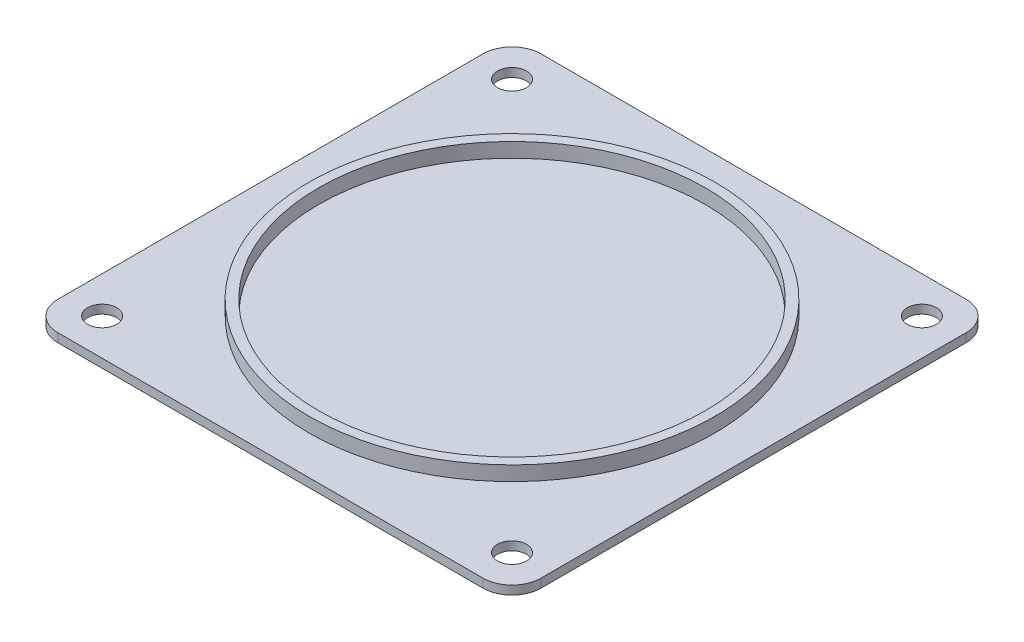
ISO-10303-21;
HEADER;
FILE_DESCRIPTION(('STEP AP214'),'2;1');
FILE_NAME('part.step','',(''),(''),'','','');
FILE_SCHEMA(('AUTOMOTIVE_DESIGN { 1 0 10303 214 1 1 1 1 }'));
ENDSEC;
DATA;
#1=APPLICATION_CONTEXT('core data for automotive mechanical design processes');
#2=APPLICATION_PROTOCOL_DEFINITION('international standard','automotive_design',2000,#1);
#3=PRODUCT_CONTEXT('',#1,'mechanical');
#4=PRODUCT('Part','Part','',(#3));
#5=PRODUCT_RELATED_PRODUCT_CATEGORY('part','',(#4));
#6=PRODUCT_DEFINITION_FORMATION('','',#4);
#7=PRODUCT_DEFINITION_CONTEXT('part definition',#1,'design');
#8=PRODUCT_DEFINITION('design','',#6,#7);
#9=PRODUCT_DEFINITION_SHAPE('','',#8);
#10=(LENGTH_UNIT() NAMED_UNIT(*) SI_UNIT(.MILLI.,.METRE.));
#11=(NAMED_UNIT(*) PLANE_ANGLE_UNIT() SI_UNIT($,.RADIAN.));
#12=(NAMED_UNIT(*) SI_UNIT($,.STERADIAN.) SOLID_ANGLE_UNIT());
#13=UNCERTAINTY_MEASURE_WITH_UNIT(LENGTH_MEASURE(1.E-05),#10,'distance_accuracy_value','');
#14=(GEOMETRIC_REPRESENTATION_CONTEXT(3) GLOBAL_UNCERTAINTY_ASSIGNED_CONTEXT((#13)) GLOBAL_UNIT_ASSIGNED_CONTEXT((#10,
#11,#12)) REPRESENTATION_CONTEXT('',''));
#15=CARTESIAN_POINT('',(0.,0.,0.));
#16=DIRECTION('',(0.,0.,1.));
#17=DIRECTION('',(1.,0.,0.));
#18=AXIS2_PLACEMENT_3D('',#15,#16,#17);
#19=CARTESIAN_POINT('',(0.,1.8,0.));
#20=DIRECTION('',(0.,1.,0.));
#21=DIRECTION('',(0.,0.,1.));
#22=AXIS2_PLACEMENT_3D('',#19,#20,#21);
#23=PLANE('',#22);
#24=CARTESIAN_POINT('',(0.,1.8,0.));
#25=DIRECTION('',(0.,1.,0.));
#26=DIRECTION('',(0.,0.,1.));
#27=AXIS2_PLACEMENT_3D('',#24,#25,#26);
#28=CIRCLE('',#27,42.);
#29=CARTESIAN_POINT('',(0.,1.8,42.));
#30=VERTEX_POINT('',#29);
#31=EDGE_CURVE('E202',#30,#30,#28,.T.);
#32=ORIENTED_EDGE('',*,*,#31,.F.);
#33=EDGE_LOOP('',(#32));
#34=FACE_BOUND('',#33,.T.);
#35=CARTESIAN_POINT('',(42.425,1.8,42.425));
#36=DIRECTION('',(0.,1.,0.));
#37=DIRECTION('',(0.,0.,1.));
#38=AXIS2_PLACEMENT_3D('',#35,#36,#37);
#39=CIRCLE('',#38,3.);
#40=CARTESIAN_POINT('',(42.425,1.8,45.425));
#41=VERTEX_POINT('',#40);
#42=EDGE_CURVE('E187',#41,#41,#39,.T.);
#43=ORIENTED_EDGE('',*,*,#42,.F.);
#44=EDGE_LOOP('',(#43));
#45=FACE_BOUND('',#44,.T.);
#46=CARTESIAN_POINT('',(-42.425,1.8,-42.425));
#47=DIRECTION('',(0.,1.,0.));
#48=DIRECTION('',(0.,0.,1.));
#49=AXIS2_PLACEMENT_3D('',#46,#47,#48);
#50=CIRCLE('',#49,3.);
#51=CARTESIAN_POINT('',(-42.425,1.8,-39.425));
#52=VERTEX_POINT('',#51);
#53=EDGE_CURVE('E171',#52,#52,#50,.T.);
#54=ORIENTED_EDGE('',*,*,#53,.F.);
#55=EDGE_LOOP('',(#54));
#56=FACE_BOUND('',#55,.T.);
#57=DIRECTION('',(0.,0.,1.));
#58=VECTOR('',#57,1.);
#59=CARTESIAN_POINT('',(-50.,1.8,-50.));
#60=LINE('',#59,#58);
#61=CARTESIAN_POINT('',(-50.,1.8,-44.));
#62=VERTEX_POINT('',#61);
#63=CARTESIAN_POINT('',(-50.,1.8,44.));
#64=VERTEX_POINT('',#63);
#65=EDGE_CURVE('E175',#62,#64,#60,.T.);
#66=ORIENTED_EDGE('',*,*,#65,.T.);
#67=CARTESIAN_POINT('',(-44.,1.8,44.));
#68=DIRECTION('',(0.,1.,0.));
#69=DIRECTION('',(0.,0.,1.));
#70=AXIS2_PLACEMENT_3D('',#67,#68,#69);
#71=CIRCLE('',#70,6.);
#72=CARTESIAN_POINT('',(-44.,1.8,50.));
#73=VERTEX_POINT('',#72);
#74=EDGE_CURVE('E148',#64,#73,#71,.T.);
#75=ORIENTED_EDGE('',*,*,#74,.T.);
#76=DIRECTION('',(1.,0.,0.));
#77=VECTOR('',#76,1.);
#78=CARTESIAN_POINT('',(-50.,1.8,50.));
#79=LINE('',#78,#77);
#80=CARTESIAN_POINT('',(44.,1.8,50.));
#81=VERTEX_POINT('',#80);
#82=EDGE_CURVE('E119',#73,#81,#79,.T.);
#83=ORIENTED_EDGE('',*,*,#82,.T.);
#84=CARTESIAN_POINT('',(44.,1.8,44.));
#85=DIRECTION('',(0.,1.,0.));
#86=DIRECTION('',(0.,0.,1.));
#87=AXIS2_PLACEMENT_3D('',#84,#85,#86);
#88=CIRCLE('',#87,6.);
#89=CARTESIAN_POINT('',(50.,1.8,44.));
#90=VERTEX_POINT('',#89);
#91=EDGE_CURVE('E143',#81,#90,#88,.T.);
#92=ORIENTED_EDGE('',*,*,#91,.T.);
#93=DIRECTION('',(0.,0.,-1.));
#94=VECTOR('',#93,1.);
#95=CARTESIAN_POINT('',(50.,1.8,-50.));
#96=LINE('',#95,#94);
#97=CARTESIAN_POINT('',(50.,1.8,-44.));
#98=VERTEX_POINT('',#97);
#99=EDGE_CURVE('E126',#90,#98,#96,.T.);
#100=ORIENTED_EDGE('',*,*,#99,.T.);
#101=CARTESIAN_POINT('',(44.,1.8,-44.));
#102=DIRECTION('',(0.,1.,0.));
#103=DIRECTION('',(0.,0.,1.));
#104=AXIS2_PLACEMENT_3D('',#101,#102,#103);
#105=CIRCLE('',#104,6.);
#106=CARTESIAN_POINT('',(44.,1.8,-50.));
#107=VERTEX_POINT('',#106);
#108=EDGE_CURVE('E54',#98,#107,#105,.T.);
#109=ORIENTED_EDGE('',*,*,#108,.T.);
#110=DIRECTION('',(-1.,0.,0.));
#111=VECTOR('',#110,1.);
#112=CARTESIAN_POINT('',(-50.,1.8,-50.));
#113=LINE('',#112,#111);
#114=CARTESIAN_POINT('',(-44.,1.8,-50.));
#115=VERTEX_POINT('',#114);
#116=EDGE_CURVE('E129',#107,#115,#113,.T.);
#117=ORIENTED_EDGE('',*,*,#116,.T.);
#118=CARTESIAN_POINT('',(-44.,1.8,-44.));
#119=DIRECTION('',(0.,1.,0.));
#120=DIRECTION('',(0.,0.,1.));
#121=AXIS2_PLACEMENT_3D('',#118,#119,#120);
#122=CIRCLE('',#121,6.);
#123=EDGE_CURVE('E146',#115,#62,#122,.T.);
#124=ORIENTED_EDGE('',*,*,#123,.T.);
#125=EDGE_LOOP('',(#66,#75,#83,#92,#100,#109,#117,#124));
#126=FACE_BOUND('',#125,.T.);
#127=CARTESIAN_POINT('',(42.425,1.8,-42.425));
#128=DIRECTION('',(0.,1.,0.));
#129=DIRECTION('',(0.,0.,1.));
#130=AXIS2_PLACEMENT_3D('',#127,#128,#129);
#131=CIRCLE('',#130,3.);
#132=CARTESIAN_POINT('',(42.425,1.8,-39.425));
#133=VERTEX_POINT('',#132);
#134=EDGE_CURVE('E181',#133,#133,#131,.T.);
#135=ORIENTED_EDGE('',*,*,#134,.F.);
#136=EDGE_LOOP('',(#135));
#137=FACE_BOUND('',#136,.T.);
#138=CARTESIAN_POINT('',(-42.425,1.8,42.425));
#139=DIRECTION('',(0.,1.,0.));
#140=DIRECTION('',(0.,0.,1.));
#141=AXIS2_PLACEMENT_3D('',#138,#139,#140);
#142=CIRCLE('',#141,3.);
#143=CARTESIAN_POINT('',(-42.425,1.8,45.425));
#144=VERTEX_POINT('',#143);
#145=EDGE_CURVE('E193',#144,#144,#142,.T.);
#146=ORIENTED_EDGE('',*,*,#145,.F.);
#147=EDGE_LOOP('',(#146));
#148=FACE_BOUND('',#147,.T.);
#149=ADVANCED_FACE('F32',(#34,#45,#56,#126,#137,#148),#23,.T.);
#150=CARTESIAN_POINT('',(0.,0.,0.));
#151=DIRECTION('',(0.,1.,0.));
#152=DIRECTION('',(0.,0.,1.));
#153=AXIS2_PLACEMENT_3D('',#150,#151,#152);
#154=PLANE('',#153);
#155=DIRECTION('',(1.,0.,0.));
#156=VECTOR('',#155,1.);
#157=CARTESIAN_POINT('',(-50.,0.,50.));
#158=LINE('',#157,#156);
#159=CARTESIAN_POINT('',(-44.,0.,50.));
#160=VERTEX_POINT('',#159);
#161=CARTESIAN_POINT('',(44.,0.,50.));
#162=VERTEX_POINT('',#161);
#163=EDGE_CURVE('E116',#160,#162,#158,.T.);
#164=ORIENTED_EDGE('',*,*,#163,.F.);
#165=CARTESIAN_POINT('',(-44.,0.,44.));
#166=DIRECTION('',(0.,1.,0.));
#167=DIRECTION('',(0.,0.,1.));
#168=AXIS2_PLACEMENT_3D('',#165,#166,#167);
#169=CIRCLE('',#168,6.);
#170=CARTESIAN_POINT('',(-50.,0.,44.));
#171=VERTEX_POINT('',#170);
#172=EDGE_CURVE('E99',#160,#171,#169,.F.);
#173=ORIENTED_EDGE('',*,*,#172,.T.);
#174=DIRECTION('',(0.,0.,1.));
#175=VECTOR('',#174,1.);
#176=CARTESIAN_POINT('',(-50.,0.,-50.));
#177=LINE('',#176,#175);
#178=CARTESIAN_POINT('',(-50.,0.,-44.));
#179=VERTEX_POINT('',#178);
#180=EDGE_CURVE('E127',#179,#171,#177,.T.);
#181=ORIENTED_EDGE('',*,*,#180,.F.);
#182=CARTESIAN_POINT('',(-44.,0.,-44.));
#183=DIRECTION('',(0.,1.,0.));
#184=DIRECTION('',(0.,0.,1.));
#185=AXIS2_PLACEMENT_3D('',#182,#183,#184);
#186=CIRCLE('',#185,6.);
#187=CARTESIAN_POINT('',(-44.,0.,-50.));
#188=VERTEX_POINT('',#187);
#189=EDGE_CURVE('E110',#179,#188,#186,.F.);
#190=ORIENTED_EDGE('',*,*,#189,.T.);
#191=DIRECTION('',(-1.,0.,0.));
#192=VECTOR('',#191,1.);
#193=CARTESIAN_POINT('',(-50.,0.,-50.));
#194=LINE('',#193,#192);
#195=CARTESIAN_POINT('',(44.,0.,-50.));
#196=VERTEX_POINT('',#195);
#197=EDGE_CURVE('E131',#196,#188,#194,.T.);
#198=ORIENTED_EDGE('',*,*,#197,.F.);
#199=CARTESIAN_POINT('',(44.,0.,-44.));
#200=DIRECTION('',(0.,1.,0.));
#201=DIRECTION('',(0.,0.,1.));
#202=AXIS2_PLACEMENT_3D('',#199,#200,#201);
#203=CIRCLE('',#202,6.);
#204=CARTESIAN_POINT('',(50.,0.,-44.));
#205=VERTEX_POINT('',#204);
#206=EDGE_CURVE('E137',#196,#205,#203,.F.);
#207=ORIENTED_EDGE('',*,*,#206,.T.);
#208=DIRECTION('',(0.,0.,-1.));
#209=VECTOR('',#208,1.);
#210=CARTESIAN_POINT('',(50.,0.,-50.));
#211=LINE('',#210,#209);
#212=CARTESIAN_POINT('',(50.,0.,44.));
#213=VERTEX_POINT('',#212);
#214=EDGE_CURVE('E162',#213,#205,#211,.T.);
#215=ORIENTED_EDGE('',*,*,#214,.F.);
#216=CARTESIAN_POINT('',(44.,0.,44.));
#217=DIRECTION('',(0.,1.,0.));
#218=DIRECTION('',(0.,0.,1.));
#219=AXIS2_PLACEMENT_3D('',#216,#217,#218);
#220=CIRCLE('',#219,6.);
#221=EDGE_CURVE('E120',#213,#162,#220,.F.);
#222=ORIENTED_EDGE('',*,*,#221,.T.);
#223=EDGE_LOOP('',(#164,#173,#181,#190,#198,#207,#215,#222));
#224=FACE_BOUND('',#223,.T.);
#225=CARTESIAN_POINT('',(-42.425,0.,-42.425));
#226=DIRECTION('',(0.,1.,0.));
#227=DIRECTION('',(0.,0.,1.));
#228=AXIS2_PLACEMENT_3D('',#225,#226,#227);
#229=CIRCLE('',#228,3.);
#230=CARTESIAN_POINT('',(-42.425,0.,-39.425));
#231=VERTEX_POINT('',#230);
#232=EDGE_CURVE('E178',#231,#231,#229,.T.);
#233=ORIENTED_EDGE('',*,*,#232,.T.);
#234=EDGE_LOOP('',(#233));
#235=FACE_BOUND('',#234,.T.);
#236=CARTESIAN_POINT('',(42.425,0.,-42.425));
#237=DIRECTION('',(0.,1.,0.));
#238=DIRECTION('',(0.,0.,1.));
#239=AXIS2_PLACEMENT_3D('',#236,#237,#238);
#240=CIRCLE('',#239,3.);
#241=CARTESIAN_POINT('',(42.425,0.,-39.425));
#242=VERTEX_POINT('',#241);
#243=EDGE_CURVE('E184',#242,#242,#240,.T.);
#244=ORIENTED_EDGE('',*,*,#243,.T.);
#245=EDGE_LOOP('',(#244));
#246=FACE_BOUND('',#245,.T.);
#247=CARTESIAN_POINT('',(42.425,0.,42.425));
#248=DIRECTION('',(0.,1.,0.));
#249=DIRECTION('',(0.,0.,1.));
#250=AXIS2_PLACEMENT_3D('',#247,#248,#249);
#251=CIRCLE('',#250,3.);
#252=CARTESIAN_POINT('',(42.425,0.,45.425));
#253=VERTEX_POINT('',#252);
#254=EDGE_CURVE('E190',#253,#253,#251,.T.);
#255=ORIENTED_EDGE('',*,*,#254,.T.);
#256=EDGE_LOOP('',(#255));
#257=FACE_BOUND('',#256,.T.);
#258=CARTESIAN_POINT('',(-42.425,0.,42.425));
#259=DIRECTION('',(0.,1.,0.));
#260=DIRECTION('',(0.,0.,1.));
#261=AXIS2_PLACEMENT_3D('',#258,#259,#260);
#262=CIRCLE('',#261,3.);
#263=CARTESIAN_POINT('',(-42.425,0.,45.425));
#264=VERTEX_POINT('',#263);
#265=EDGE_CURVE('E196',#264,#264,#262,.T.);
#266=ORIENTED_EDGE('',*,*,#265,.T.);
#267=EDGE_LOOP('',(#266));
#268=FACE_BOUND('',#267,.T.);
#269=ADVANCED_FACE('F123',(#224,#235,#246,#257,#268),#154,.F.);
#270=CARTESIAN_POINT('',(50.,1.8,-50.));
#271=DIRECTION('',(-1.,0.,0.));
#272=DIRECTION('',(0.,0.,1.));
#273=AXIS2_PLACEMENT_3D('',#270,#271,#272);
#274=PLANE('',#273);
#275=ORIENTED_EDGE('',*,*,#214,.T.);
#276=DIRECTION('',(0.,-1.,0.));
#277=VECTOR('',#276,1.);
#278=CARTESIAN_POINT('',(50.,1.8,-44.));
#279=LINE('',#278,#277);
#280=EDGE_CURVE('E40',#205,#98,#279,.F.);
#281=ORIENTED_EDGE('',*,*,#280,.T.);
#282=ORIENTED_EDGE('',*,*,#99,.F.);
#283=DIRECTION('',(0.,-1.,0.));
#284=VECTOR('',#283,1.);
#285=CARTESIAN_POINT('',(50.,1.8,44.));
#286=LINE('',#285,#284);
#287=EDGE_CURVE('E154',#90,#213,#286,.T.);
#288=ORIENTED_EDGE('',*,*,#287,.T.);
#289=EDGE_LOOP('',(#275,#281,#282,#288));
#290=FACE_BOUND('',#289,.T.);
#291=ADVANCED_FACE('F160',(#290),#274,.F.);
#292=CARTESIAN_POINT('',(-50.,1.8,-50.));
#293=DIRECTION('',(0.,0.,1.));
#294=DIRECTION('',(1.,0.,0.));
#295=AXIS2_PLACEMENT_3D('',#292,#293,#294);
#296=PLANE('',#295);
#297=ORIENTED_EDGE('',*,*,#197,.T.);
#298=DIRECTION('',(0.,-1.,0.));
#299=VECTOR('',#298,1.);
#300=CARTESIAN_POINT('',(-44.,1.8,-50.));
#301=LINE('',#300,#299);
#302=EDGE_CURVE('E47',#188,#115,#301,.F.);
#303=ORIENTED_EDGE('',*,*,#302,.T.);
#304=ORIENTED_EDGE('',*,*,#116,.F.);
#305=DIRECTION('',(0.,-1.,0.));
#306=VECTOR('',#305,1.);
#307=CARTESIAN_POINT('',(44.,1.8,-50.));
#308=LINE('',#307,#306);
#309=EDGE_CURVE('E150',#107,#196,#308,.T.);
#310=ORIENTED_EDGE('',*,*,#309,.T.);
#311=EDGE_LOOP('',(#297,#303,#304,#310));
#312=FACE_BOUND('',#311,.T.);
#313=ADVANCED_FACE('F170',(#312),#296,.F.);
#314=CARTESIAN_POINT('',(-50.,1.8,-50.));
#315=DIRECTION('',(1.,0.,0.));
#316=DIRECTION('',(0.,0.,-1.));
#317=AXIS2_PLACEMENT_3D('',#314,#315,#316);
#318=PLANE('',#317);
#319=ORIENTED_EDGE('',*,*,#180,.T.);
#320=DIRECTION('',(0.,-1.,0.));
#321=VECTOR('',#320,1.);
#322=CARTESIAN_POINT('',(-50.,1.8,44.));
#323=LINE('',#322,#321);
#324=EDGE_CURVE('E104',#171,#64,#323,.F.);
#325=ORIENTED_EDGE('',*,*,#324,.T.);
#326=ORIENTED_EDGE('',*,*,#65,.F.);
#327=DIRECTION('',(0.,-1.,0.));
#328=VECTOR('',#327,1.);
#329=CARTESIAN_POINT('',(-50.,1.8,-44.));
#330=LINE('',#329,#328);
#331=EDGE_CURVE('E109',#62,#179,#330,.T.);
#332=ORIENTED_EDGE('',*,*,#331,.T.);
#333=EDGE_LOOP('',(#319,#325,#326,#332));
#334=FACE_BOUND('',#333,.T.);
#335=ADVANCED_FACE('F334',(#334),#318,.F.);
#336=CARTESIAN_POINT('',(-50.,1.8,50.));
#337=DIRECTION('',(0.,0.,-1.));
#338=DIRECTION('',(-1.,0.,0.));
#339=AXIS2_PLACEMENT_3D('',#336,#337,#338);
#340=PLANE('',#339);
#341=ORIENTED_EDGE('',*,*,#82,.F.);
#342=DIRECTION('',(0.,-1.,0.));
#343=VECTOR('',#342,1.);
#344=CARTESIAN_POINT('',(-44.,1.8,50.));
#345=LINE('',#344,#343);
#346=EDGE_CURVE('E103',#73,#160,#345,.T.);
#347=ORIENTED_EDGE('',*,*,#346,.T.);
#348=ORIENTED_EDGE('',*,*,#163,.T.);
#349=DIRECTION('',(0.,-1.,0.));
#350=VECTOR('',#349,1.);
#351=CARTESIAN_POINT('',(44.,1.8,50.));
#352=LINE('',#351,#350);
#353=EDGE_CURVE('E121',#162,#81,#352,.F.);
#354=ORIENTED_EDGE('',*,*,#353,.T.);
#355=EDGE_LOOP('',(#341,#347,#348,#354));
#356=FACE_BOUND('',#355,.T.);
#357=ADVANCED_FACE('F115',(#356),#340,.F.);
#358=CARTESIAN_POINT('',(-42.425,1.8,-42.425));
#359=DIRECTION('',(0.,-1.,0.));
#360=DIRECTION('',(0.,0.,-1.));
#361=AXIS2_PLACEMENT_3D('',#358,#359,#360);
#362=CYLINDRICAL_SURFACE('',#361,3.);
#363=ORIENTED_EDGE('',*,*,#53,.T.);
#364=EDGE_LOOP('',(#363));
#365=FACE_BOUND('',#364,.T.);
#366=ORIENTED_EDGE('',*,*,#232,.F.);
#367=EDGE_LOOP('',(#366));
#368=FACE_BOUND('',#367,.T.);
#369=ADVANCED_FACE('F316',(#365,#368),#362,.F.);
#370=CARTESIAN_POINT('',(42.425,1.8,-42.425));
#371=DIRECTION('',(0.,-1.,0.));
#372=DIRECTION('',(0.,0.,-1.));
#373=AXIS2_PLACEMENT_3D('',#370,#371,#372);
#374=CYLINDRICAL_SURFACE('',#373,3.);
#375=ORIENTED_EDGE('',*,*,#134,.T.);
#376=EDGE_LOOP('',(#375));
#377=FACE_BOUND('',#376,.T.);
#378=ORIENTED_EDGE('',*,*,#243,.F.);
#379=EDGE_LOOP('',(#378));
#380=FACE_BOUND('',#379,.T.);
#381=ADVANCED_FACE('F306',(#377,#380),#374,.F.);
#382=CARTESIAN_POINT('',(42.425,1.8,42.425));
#383=DIRECTION('',(0.,-1.,0.));
#384=DIRECTION('',(0.,0.,-1.));
#385=AXIS2_PLACEMENT_3D('',#382,#383,#384);
#386=CYLINDRICAL_SURFACE('',#385,3.);
#387=ORIENTED_EDGE('',*,*,#42,.T.);
#388=EDGE_LOOP('',(#387));
#389=FACE_BOUND('',#388,.T.);
#390=ORIENTED_EDGE('',*,*,#254,.F.);
#391=EDGE_LOOP('',(#390));
#392=FACE_BOUND('',#391,.T.);
#393=ADVANCED_FACE('F296',(#389,#392),#386,.F.);
#394=CARTESIAN_POINT('',(-42.425,1.8,42.425));
#395=DIRECTION('',(0.,-1.,0.));
#396=DIRECTION('',(0.,0.,-1.));
#397=AXIS2_PLACEMENT_3D('',#394,#395,#396);
#398=CYLINDRICAL_SURFACE('',#397,3.);
#399=ORIENTED_EDGE('',*,*,#145,.T.);
#400=EDGE_LOOP('',(#399));
#401=FACE_BOUND('',#400,.T.);
#402=ORIENTED_EDGE('',*,*,#265,.F.);
#403=EDGE_LOOP('',(#402));
#404=FACE_BOUND('',#403,.T.);
#405=ADVANCED_FACE('F287',(#401,#404),#398,.F.);
#406=CARTESIAN_POINT('',(-44.,1.8,44.));
#407=DIRECTION('',(0.,-1.,0.));
#408=DIRECTION('',(0.,0.,-1.));
#409=AXIS2_PLACEMENT_3D('',#406,#407,#408);
#410=CYLINDRICAL_SURFACE('',#409,6.);
#411=ORIENTED_EDGE('',*,*,#74,.F.);
#412=ORIENTED_EDGE('',*,*,#324,.F.);
#413=ORIENTED_EDGE('',*,*,#172,.F.);
#414=ORIENTED_EDGE('',*,*,#346,.F.);
#415=EDGE_LOOP('',(#411,#412,#413,#414));
#416=FACE_BOUND('',#415,.T.);
#417=ADVANCED_FACE('F102',(#416),#410,.T.);
#418=CARTESIAN_POINT('',(-44.,1.8,-44.));
#419=DIRECTION('',(0.,-1.,0.));
#420=DIRECTION('',(0.,0.,-1.));
#421=AXIS2_PLACEMENT_3D('',#418,#419,#420);
#422=CYLINDRICAL_SURFACE('',#421,6.);
#423=ORIENTED_EDGE('',*,*,#123,.F.);
#424=ORIENTED_EDGE('',*,*,#302,.F.);
#425=ORIENTED_EDGE('',*,*,#189,.F.);
#426=ORIENTED_EDGE('',*,*,#331,.F.);
#427=EDGE_LOOP('',(#423,#424,#425,#426));
#428=FACE_BOUND('',#427,.T.);
#429=ADVANCED_FACE('F270',(#428),#422,.T.);
#430=CARTESIAN_POINT('',(44.,1.8,-44.));
#431=DIRECTION('',(0.,-1.,0.));
#432=DIRECTION('',(0.,0.,-1.));
#433=AXIS2_PLACEMENT_3D('',#430,#431,#432);
#434=CYLINDRICAL_SURFACE('',#433,6.);
#435=ORIENTED_EDGE('',*,*,#108,.F.);
#436=ORIENTED_EDGE('',*,*,#280,.F.);
#437=ORIENTED_EDGE('',*,*,#206,.F.);
#438=ORIENTED_EDGE('',*,*,#309,.F.);
#439=EDGE_LOOP('',(#435,#436,#437,#438));
#440=FACE_BOUND('',#439,.T.);
#441=ADVANCED_FACE('F168',(#440),#434,.T.);
#442=CARTESIAN_POINT('',(44.,1.8,44.));
#443=DIRECTION('',(0.,-1.,0.));
#444=DIRECTION('',(0.,0.,-1.));
#445=AXIS2_PLACEMENT_3D('',#442,#443,#444);
#446=CYLINDRICAL_SURFACE('',#445,6.);
#447=ORIENTED_EDGE('',*,*,#91,.F.);
#448=ORIENTED_EDGE('',*,*,#353,.F.);
#449=ORIENTED_EDGE('',*,*,#221,.F.);
#450=ORIENTED_EDGE('',*,*,#287,.F.);
#451=EDGE_LOOP('',(#447,#448,#449,#450));
#452=FACE_BOUND('',#451,.T.);
#453=ADVANCED_FACE('F34',(#452),#446,.T.);
#454=CARTESIAN_POINT('',(0.,4.8,0.));
#455=DIRECTION('',(0.,1.,0.));
#456=DIRECTION('',(0.,0.,1.));
#457=AXIS2_PLACEMENT_3D('',#454,#455,#456);
#458=PLANE('',#457);
#459=CARTESIAN_POINT('',(0.,4.8,0.));
#460=DIRECTION('',(0.,1.,0.));
#461=DIRECTION('',(0.,0.,1.));
#462=AXIS2_PLACEMENT_3D('',#459,#460,#461);
#463=CIRCLE('',#462,42.);
#464=CARTESIAN_POINT('',(0.,4.8,42.));
#465=VERTEX_POINT('',#464);
#466=EDGE_CURVE('E199',#465,#465,#463,.T.);
#467=ORIENTED_EDGE('',*,*,#466,.T.);
#468=EDGE_LOOP('',(#467));
#469=FACE_BOUND('',#468,.T.);
#470=CARTESIAN_POINT('',(0.,4.8,0.));
#471=DIRECTION('',(0.,1.,0.));
#472=DIRECTION('',(0.,0.,1.));
#473=AXIS2_PLACEMENT_3D('',#470,#471,#472);
#474=CIRCLE('',#473,40.);
#475=CARTESIAN_POINT('',(0.,4.8,40.));
#476=VERTEX_POINT('',#475);
#477=EDGE_CURVE('E205',#476,#476,#474,.T.);
#478=ORIENTED_EDGE('',*,*,#477,.F.);
#479=EDGE_LOOP('',(#478));
#480=FACE_BOUND('',#479,.T.);
#481=ADVANCED_FACE('F214',(#469,#480),#458,.T.);
#482=CARTESIAN_POINT('',(0.,4.8,0.));
#483=DIRECTION('',(0.,-1.,0.));
#484=DIRECTION('',(0.,0.,-1.));
#485=AXIS2_PLACEMENT_3D('',#482,#483,#484);
#486=CYLINDRICAL_SURFACE('',#485,42.);
#487=ORIENTED_EDGE('',*,*,#466,.F.);
#488=EDGE_LOOP('',(#487));
#489=FACE_BOUND('',#488,.T.);
#490=ORIENTED_EDGE('',*,*,#31,.T.);
#491=EDGE_LOOP('',(#490));
#492=FACE_BOUND('',#491,.T.);
#493=ADVANCED_FACE('F216',(#489,#492),#486,.T.);
#494=CARTESIAN_POINT('',(0.,4.8,0.));
#495=DIRECTION('',(0.,-1.,0.));
#496=DIRECTION('',(0.,0.,-1.));
#497=AXIS2_PLACEMENT_3D('',#494,#495,#496);
#498=CYLINDRICAL_SURFACE('',#497,40.);
#499=ORIENTED_EDGE('',*,*,#477,.T.);
#500=EDGE_LOOP('',(#499));
#501=FACE_BOUND('',#500,.T.);
#502=CARTESIAN_POINT('',(0.,1.8,0.));
#503=DIRECTION('',(0.,1.,0.));
#504=DIRECTION('',(0.,0.,1.));
#505=AXIS2_PLACEMENT_3D('',#502,#503,#504);
#506=CIRCLE('',#505,40.);
#507=CARTESIAN_POINT('',(0.,1.8,40.));
#508=VERTEX_POINT('',#507);
#509=EDGE_CURVE('E11',#508,#508,#506,.F.);
#510=ORIENTED_EDGE('',*,*,#509,.T.);
#511=EDGE_LOOP('',(#510));
#512=FACE_BOUND('',#511,.T.);
#513=ADVANCED_FACE('F211',(#501,#512),#498,.F.);
#514=ORIENTED_EDGE('',*,*,#509,.F.);
#515=EDGE_LOOP('',(#514));
#516=FACE_BOUND('',#515,.T.);
#517=ADVANCED_FACE('F230',(#516),#23,.T.);
#518=CLOSED_SHELL('',(#149,#269,#291,#313,#335,#357,#369,#381,#393,#405,#417,#429,#441,#453,
#481,#493,#513,#517));
#519=MANIFOLD_SOLID_BREP('B2',#518);
#520=ADVANCED_BREP_SHAPE_REPRESENTATION('',(#18,#519),#14);
#521=SHAPE_DEFINITION_REPRESENTATION(#9,#520);
ENDSEC;
END-ISO-10303-21;
